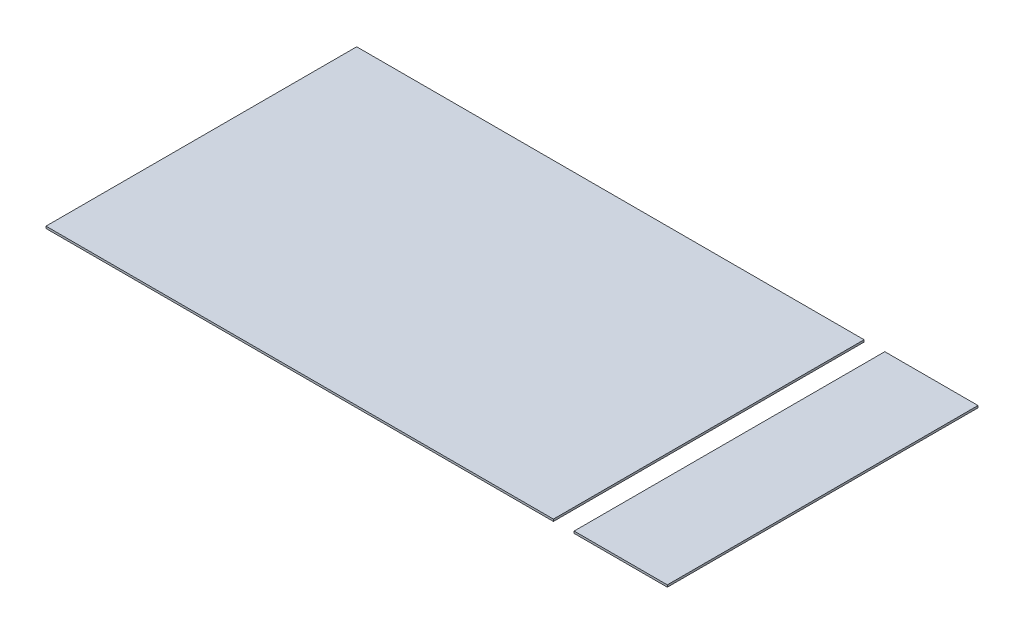
ISO-10303-21;
HEADER;
FILE_DESCRIPTION(('STEP AP214'),'2;1');
FILE_NAME('part.step','',(''),(''),'','','');
FILE_SCHEMA(('AUTOMOTIVE_DESIGN { 1 0 10303 214 1 1 1 1 }'));
ENDSEC;
DATA;
#1=APPLICATION_CONTEXT('core data for automotive mechanical design processes');
#2=APPLICATION_PROTOCOL_DEFINITION('international standard','automotive_design',2000,#1);
#3=PRODUCT_CONTEXT('',#1,'mechanical');
#4=PRODUCT('Part','Part','',(#3));
#5=PRODUCT_RELATED_PRODUCT_CATEGORY('part','',(#4));
#6=PRODUCT_DEFINITION_FORMATION('','',#4);
#7=PRODUCT_DEFINITION_CONTEXT('part definition',#1,'design');
#8=PRODUCT_DEFINITION('design','',#6,#7);
#9=PRODUCT_DEFINITION_SHAPE('','',#8);
#10=(LENGTH_UNIT() NAMED_UNIT(*) SI_UNIT(.MILLI.,.METRE.));
#11=(NAMED_UNIT(*) PLANE_ANGLE_UNIT() SI_UNIT($,.RADIAN.));
#12=(NAMED_UNIT(*) SI_UNIT($,.STERADIAN.) SOLID_ANGLE_UNIT());
#13=UNCERTAINTY_MEASURE_WITH_UNIT(LENGTH_MEASURE(1.E-05),#10,'distance_accuracy_value','');
#14=(GEOMETRIC_REPRESENTATION_CONTEXT(3) GLOBAL_UNCERTAINTY_ASSIGNED_CONTEXT((#13)) GLOBAL_UNIT_ASSIGNED_CONTEXT((#10,
#11,#12)) REPRESENTATION_CONTEXT('',''));
#15=CARTESIAN_POINT('',(0.,0.,0.));
#16=DIRECTION('',(0.,0.,1.));
#17=DIRECTION('',(1.,0.,0.));
#18=AXIS2_PLACEMENT_3D('',#15,#16,#17);
#19=CARTESIAN_POINT('',(17.212158808933,0.1,11.1166253101737));
#20=DIRECTION('',(1.,0.,0.));
#21=DIRECTION('',(0.,0.,-1.));
#22=AXIS2_PLACEMENT_3D('',#19,#20,#21);
#23=PLANE('',#22);
#24=DIRECTION('',(0.,0.,1.));
#25=VECTOR('',#24,1.);
#26=CARTESIAN_POINT('',(17.212158808933,0.,11.1166253101737));
#27=LINE('',#26,#25);
#28=CARTESIAN_POINT('',(17.212158808933,0.,-3.8833746898263));
#29=VERTEX_POINT('',#28);
#30=CARTESIAN_POINT('',(17.212158808933,0.,11.1166253101737));
#31=VERTEX_POINT('',#30);
#32=EDGE_CURVE('E107',#29,#31,#27,.T.);
#33=ORIENTED_EDGE('',*,*,#32,.T.);
#34=DIRECTION('',(0.,-1.,0.));
#35=VECTOR('',#34,1.);
#36=CARTESIAN_POINT('',(17.212158808933,0.1,11.1166253101737));
#37=LINE('',#36,#35);
#38=CARTESIAN_POINT('',(17.212158808933,0.1,11.1166253101737));
#39=VERTEX_POINT('',#38);
#40=EDGE_CURVE('E12',#39,#31,#37,.T.);
#41=ORIENTED_EDGE('',*,*,#40,.F.);
#42=DIRECTION('',(0.,0.,1.));
#43=VECTOR('',#42,1.);
#44=CARTESIAN_POINT('',(17.212158808933,0.1,11.1166253101737));
#45=LINE('',#44,#43);
#46=CARTESIAN_POINT('',(17.212158808933,0.1,-3.8833746898263));
#47=VERTEX_POINT('',#46);
#48=EDGE_CURVE('E95',#47,#39,#45,.T.);
#49=ORIENTED_EDGE('',*,*,#48,.F.);
#50=DIRECTION('',(0.,-1.,0.));
#51=VECTOR('',#50,1.);
#52=CARTESIAN_POINT('',(17.212158808933,0.1,-3.8833746898263));
#53=LINE('',#52,#51);
#54=EDGE_CURVE('E103',#47,#29,#53,.T.);
#55=ORIENTED_EDGE('',*,*,#54,.T.);
#56=EDGE_LOOP('',(#33,#41,#49,#55));
#57=FACE_BOUND('',#56,.T.);
#58=ADVANCED_FACE('F44',(#57),#23,.F.);
#59=CARTESIAN_POINT('',(17.212158808933,0.1,11.1166253101737));
#60=DIRECTION('',(0.,0.,-1.));
#61=DIRECTION('',(-1.,0.,0.));
#62=AXIS2_PLACEMENT_3D('',#59,#60,#61);
#63=PLANE('',#62);
#64=DIRECTION('',(1.,0.,0.));
#65=VECTOR('',#64,1.);
#66=CARTESIAN_POINT('',(17.212158808933,0.,11.1166253101737));
#67=LINE('',#66,#65);
#68=CARTESIAN_POINT('',(21.712158808933,0.,11.1166253101737));
#69=VERTEX_POINT('',#68);
#70=EDGE_CURVE('E99',#31,#69,#67,.T.);
#71=ORIENTED_EDGE('',*,*,#70,.T.);
#72=DIRECTION('',(0.,-1.,0.));
#73=VECTOR('',#72,1.);
#74=CARTESIAN_POINT('',(21.712158808933,0.1,11.1166253101737));
#75=LINE('',#74,#73);
#76=CARTESIAN_POINT('',(21.712158808933,0.1,11.1166253101737));
#77=VERTEX_POINT('',#76);
#78=EDGE_CURVE('E52',#77,#69,#75,.T.);
#79=ORIENTED_EDGE('',*,*,#78,.F.);
#80=DIRECTION('',(1.,0.,0.));
#81=VECTOR('',#80,1.);
#82=CARTESIAN_POINT('',(17.212158808933,0.1,11.1166253101737));
#83=LINE('',#82,#81);
#84=EDGE_CURVE('E90',#39,#77,#83,.T.);
#85=ORIENTED_EDGE('',*,*,#84,.F.);
#86=ORIENTED_EDGE('',*,*,#40,.T.);
#87=EDGE_LOOP('',(#71,#79,#85,#86));
#88=FACE_BOUND('',#87,.T.);
#89=ADVANCED_FACE('F98',(#88),#63,.F.);
#90=CARTESIAN_POINT('',(21.712158808933,0.1,11.1166253101737));
#91=DIRECTION('',(-1.,0.,0.));
#92=DIRECTION('',(0.,0.,1.));
#93=AXIS2_PLACEMENT_3D('',#90,#91,#92);
#94=PLANE('',#93);
#95=DIRECTION('',(0.,0.,-1.));
#96=VECTOR('',#95,1.);
#97=CARTESIAN_POINT('',(21.712158808933,0.,11.1166253101737));
#98=LINE('',#97,#96);
#99=CARTESIAN_POINT('',(21.712158808933,0.,-3.8833746898263));
#100=VERTEX_POINT('',#99);
#101=EDGE_CURVE('E77',#69,#100,#98,.T.);
#102=ORIENTED_EDGE('',*,*,#101,.T.);
#103=DIRECTION('',(0.,-1.,0.));
#104=VECTOR('',#103,1.);
#105=CARTESIAN_POINT('',(21.712158808933,0.1,-3.8833746898263));
#106=LINE('',#105,#104);
#107=CARTESIAN_POINT('',(21.712158808933,0.1,-3.8833746898263));
#108=VERTEX_POINT('',#107);
#109=EDGE_CURVE('E100',#108,#100,#106,.T.);
#110=ORIENTED_EDGE('',*,*,#109,.F.);
#111=DIRECTION('',(0.,0.,-1.));
#112=VECTOR('',#111,1.);
#113=CARTESIAN_POINT('',(21.712158808933,0.1,11.1166253101737));
#114=LINE('',#113,#112);
#115=EDGE_CURVE('E93',#77,#108,#114,.T.);
#116=ORIENTED_EDGE('',*,*,#115,.F.);
#117=ORIENTED_EDGE('',*,*,#78,.T.);
#118=EDGE_LOOP('',(#102,#110,#116,#117));
#119=FACE_BOUND('',#118,.T.);
#120=ADVANCED_FACE('F101',(#119),#94,.F.);
#121=CARTESIAN_POINT('',(17.212158808933,0.1,-3.8833746898263));
#122=DIRECTION('',(0.,0.,1.));
#123=DIRECTION('',(1.,0.,0.));
#124=AXIS2_PLACEMENT_3D('',#121,#122,#123);
#125=PLANE('',#124);
#126=DIRECTION('',(-1.,0.,0.));
#127=VECTOR('',#126,1.);
#128=CARTESIAN_POINT('',(17.212158808933,0.,-3.8833746898263));
#129=LINE('',#128,#127);
#130=EDGE_CURVE('E83',#100,#29,#129,.T.);
#131=ORIENTED_EDGE('',*,*,#130,.T.);
#132=ORIENTED_EDGE('',*,*,#54,.F.);
#133=DIRECTION('',(-1.,0.,0.));
#134=VECTOR('',#133,1.);
#135=CARTESIAN_POINT('',(17.212158808933,0.1,-3.8833746898263));
#136=LINE('',#135,#134);
#137=EDGE_CURVE('E60',#108,#47,#136,.T.);
#138=ORIENTED_EDGE('',*,*,#137,.F.);
#139=ORIENTED_EDGE('',*,*,#109,.T.);
#140=EDGE_LOOP('',(#131,#132,#138,#139));
#141=FACE_BOUND('',#140,.T.);
#142=ADVANCED_FACE('F114',(#141),#125,.F.);
#143=CARTESIAN_POINT('',(0.,0.1,0.));
#144=DIRECTION('',(0.,-1.,0.));
#145=DIRECTION('',(0.,0.,-1.));
#146=AXIS2_PLACEMENT_3D('',#143,#144,#145);
#147=PLANE('',#146);
#148=ORIENTED_EDGE('',*,*,#48,.T.);
#149=ORIENTED_EDGE('',*,*,#84,.T.);
#150=ORIENTED_EDGE('',*,*,#115,.T.);
#151=ORIENTED_EDGE('',*,*,#137,.T.);
#152=EDGE_LOOP('',(#148,#149,#150,#151));
#153=FACE_BOUND('',#152,.T.);
#154=ADVANCED_FACE('F91',(#153),#147,.F.);
#155=CARTESIAN_POINT('',(0.,0.,0.));
#156=DIRECTION('',(0.,-1.,0.));
#157=DIRECTION('',(0.,0.,-1.));
#158=AXIS2_PLACEMENT_3D('',#155,#156,#157);
#159=PLANE('',#158);
#160=ORIENTED_EDGE('',*,*,#32,.F.);
#161=ORIENTED_EDGE('',*,*,#130,.F.);
#162=ORIENTED_EDGE('',*,*,#101,.F.);
#163=ORIENTED_EDGE('',*,*,#70,.F.);
#164=EDGE_LOOP('',(#160,#161,#162,#163));
#165=FACE_BOUND('',#164,.T.);
#166=ADVANCED_FACE('F117',(#165),#159,.T.);
#167=CLOSED_SHELL('',(#58,#89,#120,#142,#154,#166));
#168=MANIFOLD_SOLID_BREP('B2',#167);
#169=CARTESIAN_POINT('',(-8.287841191067,0.1,-3.8833746898263));
#170=DIRECTION('',(1.,0.,0.));
#171=DIRECTION('',(0.,0.,-1.));
#172=AXIS2_PLACEMENT_3D('',#169,#170,#171);
#173=PLANE('',#172);
#174=DIRECTION('',(0.,0.,1.));
#175=VECTOR('',#174,1.);
#176=CARTESIAN_POINT('',(-8.287841191067,0.,-3.8833746898263));
#177=LINE('',#176,#175);
#178=CARTESIAN_POINT('',(-8.287841191067,0.,-3.8833746898263));
#179=VERTEX_POINT('',#178);
#180=CARTESIAN_POINT('',(-8.287841191067,0.,11.1166253101737));
#181=VERTEX_POINT('',#180);
#182=EDGE_CURVE('E230',#179,#181,#177,.T.);
#183=ORIENTED_EDGE('',*,*,#182,.T.);
#184=DIRECTION('',(0.,-1.,0.));
#185=VECTOR('',#184,1.);
#186=CARTESIAN_POINT('',(-8.287841191067,0.1,11.1166253101737));
#187=LINE('',#186,#185);
#188=CARTESIAN_POINT('',(-8.287841191067,0.1,11.1166253101737));
#189=VERTEX_POINT('',#188);
#190=EDGE_CURVE('E42',#189,#181,#187,.T.);
#191=ORIENTED_EDGE('',*,*,#190,.F.);
#192=DIRECTION('',(0.,0.,1.));
#193=VECTOR('',#192,1.);
#194=CARTESIAN_POINT('',(-8.287841191067,0.1,-3.8833746898263));
#195=LINE('',#194,#193);
#196=CARTESIAN_POINT('',(-8.287841191067,0.1,-3.8833746898263));
#197=VERTEX_POINT('',#196);
#198=EDGE_CURVE('E218',#197,#189,#195,.T.);
#199=ORIENTED_EDGE('',*,*,#198,.F.);
#200=DIRECTION('',(0.,-1.,0.));
#201=VECTOR('',#200,1.);
#202=CARTESIAN_POINT('',(-8.287841191067,0.1,-3.8833746898263));
#203=LINE('',#202,#201);
#204=EDGE_CURVE('E226',#197,#179,#203,.T.);
#205=ORIENTED_EDGE('',*,*,#204,.T.);
#206=EDGE_LOOP('',(#183,#191,#199,#205));
#207=FACE_BOUND('',#206,.T.);
#208=ADVANCED_FACE('F167',(#207),#173,.F.);
#209=CARTESIAN_POINT('',(-8.287841191067,0.1,11.1166253101737));
#210=DIRECTION('',(0.,0.,-1.));
#211=DIRECTION('',(-1.,0.,0.));
#212=AXIS2_PLACEMENT_3D('',#209,#210,#211);
#213=PLANE('',#212);
#214=DIRECTION('',(1.,0.,0.));
#215=VECTOR('',#214,1.);
#216=CARTESIAN_POINT('',(-8.287841191067,0.,11.1166253101737));
#217=LINE('',#216,#215);
#218=CARTESIAN_POINT('',(16.212158808933,0.,11.1166253101737));
#219=VERTEX_POINT('',#218);
#220=EDGE_CURVE('E222',#181,#219,#217,.T.);
#221=ORIENTED_EDGE('',*,*,#220,.T.);
#222=DIRECTION('',(0.,-1.,0.));
#223=VECTOR('',#222,1.);
#224=CARTESIAN_POINT('',(16.212158808933,0.1,11.1166253101737));
#225=LINE('',#224,#223);
#226=CARTESIAN_POINT('',(16.212158808933,0.1,11.1166253101737));
#227=VERTEX_POINT('',#226);
#228=EDGE_CURVE('E175',#227,#219,#225,.T.);
#229=ORIENTED_EDGE('',*,*,#228,.F.);
#230=DIRECTION('',(1.,0.,0.));
#231=VECTOR('',#230,1.);
#232=CARTESIAN_POINT('',(-8.287841191067,0.1,11.1166253101737));
#233=LINE('',#232,#231);
#234=EDGE_CURVE('E213',#189,#227,#233,.T.);
#235=ORIENTED_EDGE('',*,*,#234,.F.);
#236=ORIENTED_EDGE('',*,*,#190,.T.);
#237=EDGE_LOOP('',(#221,#229,#235,#236));
#238=FACE_BOUND('',#237,.T.);
#239=ADVANCED_FACE('F221',(#238),#213,.F.);
#240=CARTESIAN_POINT('',(16.212158808933,0.1,-3.8833746898263));
#241=DIRECTION('',(-1.,0.,0.));
#242=DIRECTION('',(0.,0.,1.));
#243=AXIS2_PLACEMENT_3D('',#240,#241,#242);
#244=PLANE('',#243);
#245=DIRECTION('',(0.,0.,-1.));
#246=VECTOR('',#245,1.);
#247=CARTESIAN_POINT('',(16.212158808933,0.,-3.8833746898263));
#248=LINE('',#247,#246);
#249=CARTESIAN_POINT('',(16.212158808933,0.,-3.8833746898263));
#250=VERTEX_POINT('',#249);
#251=EDGE_CURVE('E200',#219,#250,#248,.T.);
#252=ORIENTED_EDGE('',*,*,#251,.T.);
#253=DIRECTION('',(0.,-1.,0.));
#254=VECTOR('',#253,1.);
#255=CARTESIAN_POINT('',(16.212158808933,0.1,-3.8833746898263));
#256=LINE('',#255,#254);
#257=CARTESIAN_POINT('',(16.212158808933,0.1,-3.8833746898263));
#258=VERTEX_POINT('',#257);
#259=EDGE_CURVE('E223',#258,#250,#256,.T.);
#260=ORIENTED_EDGE('',*,*,#259,.F.);
#261=DIRECTION('',(0.,0.,-1.));
#262=VECTOR('',#261,1.);
#263=CARTESIAN_POINT('',(16.212158808933,0.1,-3.8833746898263));
#264=LINE('',#263,#262);
#265=EDGE_CURVE('E216',#227,#258,#264,.T.);
#266=ORIENTED_EDGE('',*,*,#265,.F.);
#267=ORIENTED_EDGE('',*,*,#228,.T.);
#268=EDGE_LOOP('',(#252,#260,#266,#267));
#269=FACE_BOUND('',#268,.T.);
#270=ADVANCED_FACE('F224',(#269),#244,.F.);
#271=CARTESIAN_POINT('',(-8.287841191067,0.1,-3.8833746898263));
#272=DIRECTION('',(0.,0.,1.));
#273=DIRECTION('',(1.,0.,0.));
#274=AXIS2_PLACEMENT_3D('',#271,#272,#273);
#275=PLANE('',#274);
#276=DIRECTION('',(-1.,0.,0.));
#277=VECTOR('',#276,1.);
#278=CARTESIAN_POINT('',(-8.287841191067,0.,-3.8833746898263));
#279=LINE('',#278,#277);
#280=EDGE_CURVE('E206',#250,#179,#279,.T.);
#281=ORIENTED_EDGE('',*,*,#280,.T.);
#282=ORIENTED_EDGE('',*,*,#204,.F.);
#283=DIRECTION('',(-1.,0.,0.));
#284=VECTOR('',#283,1.);
#285=CARTESIAN_POINT('',(-8.287841191067,0.1,-3.8833746898263));
#286=LINE('',#285,#284);
#287=EDGE_CURVE('E183',#258,#197,#286,.T.);
#288=ORIENTED_EDGE('',*,*,#287,.F.);
#289=ORIENTED_EDGE('',*,*,#259,.T.);
#290=EDGE_LOOP('',(#281,#282,#288,#289));
#291=FACE_BOUND('',#290,.T.);
#292=ADVANCED_FACE('F237',(#291),#275,.F.);
#293=CARTESIAN_POINT('',(0.,0.1,0.));
#294=DIRECTION('',(0.,1.,0.));
#295=DIRECTION('',(0.,0.,1.));
#296=AXIS2_PLACEMENT_3D('',#293,#294,#295);
#297=PLANE('',#296);
#298=ORIENTED_EDGE('',*,*,#198,.T.);
#299=ORIENTED_EDGE('',*,*,#234,.T.);
#300=ORIENTED_EDGE('',*,*,#265,.T.);
#301=ORIENTED_EDGE('',*,*,#287,.T.);
#302=EDGE_LOOP('',(#298,#299,#300,#301));
#303=FACE_BOUND('',#302,.T.);
#304=ADVANCED_FACE('F214',(#303),#297,.T.);
#305=CARTESIAN_POINT('',(0.,0.,0.));
#306=DIRECTION('',(0.,1.,0.));
#307=DIRECTION('',(0.,0.,1.));
#308=AXIS2_PLACEMENT_3D('',#305,#306,#307);
#309=PLANE('',#308);
#310=ORIENTED_EDGE('',*,*,#182,.F.);
#311=ORIENTED_EDGE('',*,*,#280,.F.);
#312=ORIENTED_EDGE('',*,*,#251,.F.);
#313=ORIENTED_EDGE('',*,*,#220,.F.);
#314=EDGE_LOOP('',(#310,#311,#312,#313));
#315=FACE_BOUND('',#314,.T.);
#316=ADVANCED_FACE('F240',(#315),#309,.F.);
#317=CLOSED_SHELL('',(#208,#239,#270,#292,#304,#316));
#318=MANIFOLD_SOLID_BREP('B6',#317);
#319=ADVANCED_BREP_SHAPE_REPRESENTATION('',(#18,#168,#318),#14);
#320=SHAPE_DEFINITION_REPRESENTATION(#9,#319);
ENDSEC;
END-ISO-10303-21;
